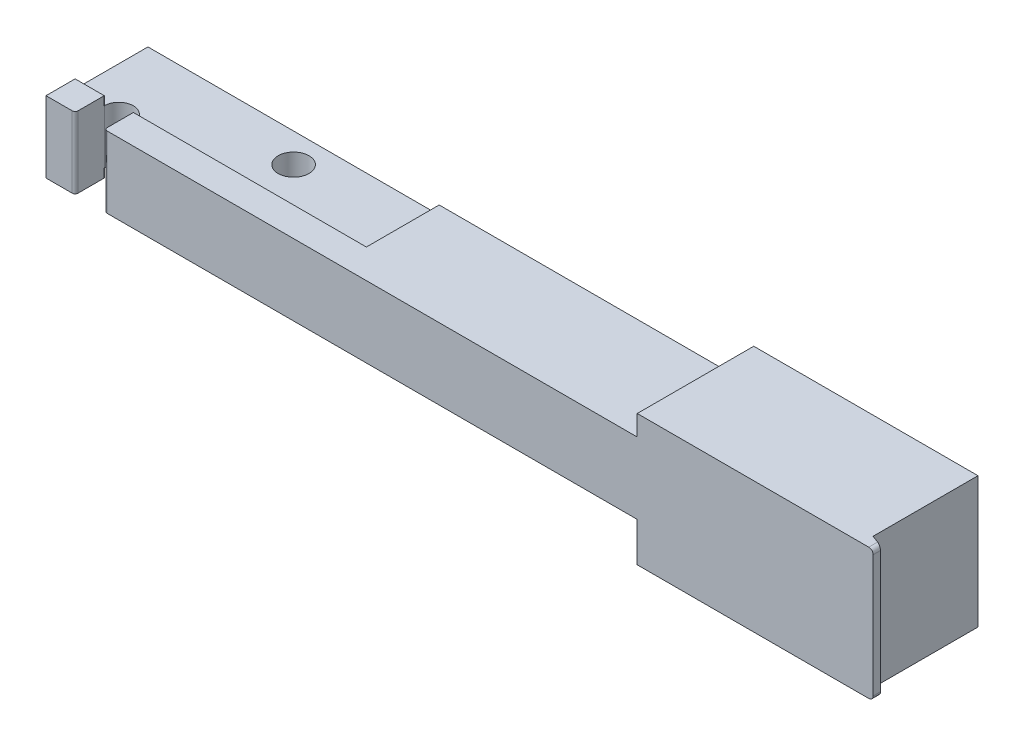
ISO-10303-21;
HEADER;
FILE_DESCRIPTION(('STEP AP214'),'2;1');
FILE_NAME('part.step','',(''),(''),'','','');
FILE_SCHEMA(('AUTOMOTIVE_DESIGN { 1 0 10303 214 1 1 1 1 }'));
ENDSEC;
DATA;
#1=APPLICATION_CONTEXT('core data for automotive mechanical design processes');
#2=APPLICATION_PROTOCOL_DEFINITION('international standard','automotive_design',2000,#1);
#3=PRODUCT_CONTEXT('',#1,'mechanical');
#4=PRODUCT('Part','Part','',(#3));
#5=PRODUCT_RELATED_PRODUCT_CATEGORY('part','',(#4));
#6=PRODUCT_DEFINITION_FORMATION('','',#4);
#7=PRODUCT_DEFINITION_CONTEXT('part definition',#1,'design');
#8=PRODUCT_DEFINITION('design','',#6,#7);
#9=PRODUCT_DEFINITION_SHAPE('','',#8);
#10=(LENGTH_UNIT() NAMED_UNIT(*) SI_UNIT(.MILLI.,.METRE.));
#11=(NAMED_UNIT(*) PLANE_ANGLE_UNIT() SI_UNIT($,.RADIAN.));
#12=(NAMED_UNIT(*) SI_UNIT($,.STERADIAN.) SOLID_ANGLE_UNIT());
#13=UNCERTAINTY_MEASURE_WITH_UNIT(LENGTH_MEASURE(1.E-05),#10,'distance_accuracy_value','');
#14=(GEOMETRIC_REPRESENTATION_CONTEXT(3) GLOBAL_UNCERTAINTY_ASSIGNED_CONTEXT((#13)) GLOBAL_UNIT_ASSIGNED_CONTEXT((#10,
#11,#12)) REPRESENTATION_CONTEXT('',''));
#15=CARTESIAN_POINT('',(0.,0.,0.));
#16=DIRECTION('',(0.,0.,1.));
#17=DIRECTION('',(1.,0.,0.));
#18=AXIS2_PLACEMENT_3D('',#15,#16,#17);
#19=CARTESIAN_POINT('',(7.5,-0.00100000000003569,-5.));
#20=DIRECTION('',(0.,1.,0.));
#21=DIRECTION('',(-1.,0.,0.));
#22=AXIS2_PLACEMENT_3D('',#19,#20,#21);
#23=CYLINDRICAL_SURFACE('',#22,2.5);
#24=CARTESIAN_POINT('',(7.5,8.25,-5.));
#25=DIRECTION('',(0.,1.,0.));
#26=DIRECTION('',(0.,0.,1.));
#27=AXIS2_PLACEMENT_3D('',#24,#25,#26);
#28=CIRCLE('',#27,2.5);
#29=CARTESIAN_POINT('',(5.,8.25,-5.));
#30=VERTEX_POINT('',#29);
#31=CARTESIAN_POINT('',(10.,8.25,-5.));
#32=VERTEX_POINT('',#31);
#33=EDGE_CURVE('E245',#30,#32,#28,.F.);
#34=ORIENTED_EDGE('',*,*,#33,.T.);
#35=DIRECTION('',(0.,1.,0.));
#36=VECTOR('',#35,1.);
#37=CARTESIAN_POINT('',(10.,-0.00100000000003569,-5.));
#38=LINE('',#37,#36);
#39=CARTESIAN_POINT('',(10.,17.5,-5.));
#40=VERTEX_POINT('',#39);
#41=EDGE_CURVE('E238',#32,#40,#38,.T.);
#42=ORIENTED_EDGE('',*,*,#41,.T.);
#43=CARTESIAN_POINT('',(7.5,17.5,-5.));
#44=DIRECTION('',(0.,1.,0.));
#45=DIRECTION('',(0.,0.,1.));
#46=AXIS2_PLACEMENT_3D('',#43,#44,#45);
#47=CIRCLE('',#46,2.5);
#48=CARTESIAN_POINT('',(5.,17.5,-5.));
#49=VERTEX_POINT('',#48);
#50=EDGE_CURVE('E433',#49,#40,#47,.F.);
#51=ORIENTED_EDGE('',*,*,#50,.F.);
#52=DIRECTION('',(0.,1.,0.));
#53=VECTOR('',#52,1.);
#54=CARTESIAN_POINT('',(5.,-0.00100000000003569,-5.));
#55=LINE('',#54,#53);
#56=EDGE_CURVE('E237',#30,#49,#55,.T.);
#57=ORIENTED_EDGE('',*,*,#56,.F.);
#58=EDGE_LOOP('',(#34,#42,#51,#57));
#59=FACE_BOUND('',#58,.T.);
#60=ADVANCED_FACE('F47',(#59),#23,.F.);
#61=CARTESIAN_POINT('',(30.,-0.00100000000003223,-12.5));
#62=DIRECTION('',(0.,1.,0.));
#63=DIRECTION('',(-1.,0.,0.));
#64=AXIS2_PLACEMENT_3D('',#61,#62,#63);
#65=CYLINDRICAL_SURFACE('',#64,2.65);
#66=CARTESIAN_POINT('',(30.,17.5,-12.5));
#67=DIRECTION('',(0.,1.,0.));
#68=DIRECTION('',(0.,0.,1.));
#69=AXIS2_PLACEMENT_3D('',#66,#67,#68);
#70=CIRCLE('',#69,2.65);
#71=CARTESIAN_POINT('',(30.,17.5,-9.85));
#72=VERTEX_POINT('',#71);
#73=EDGE_CURVE('E461',#72,#72,#70,.F.);
#74=ORIENTED_EDGE('',*,*,#73,.F.);
#75=EDGE_LOOP('',(#74));
#76=FACE_BOUND('',#75,.T.);
#77=CARTESIAN_POINT('',(30.,8.25,-12.5));
#78=DIRECTION('',(0.,1.,0.));
#79=DIRECTION('',(0.,0.,1.));
#80=AXIS2_PLACEMENT_3D('',#77,#78,#79);
#81=CIRCLE('',#80,2.65);
#82=CARTESIAN_POINT('',(30.,8.25,-9.85));
#83=VERTEX_POINT('',#82);
#84=EDGE_CURVE('E249',#83,#83,#81,.F.);
#85=ORIENTED_EDGE('',*,*,#84,.T.);
#86=EDGE_LOOP('',(#85));
#87=FACE_BOUND('',#86,.T.);
#88=ADVANCED_FACE('F485',(#76,#87),#65,.F.);
#89=CARTESIAN_POINT('',(0.,0.,-20.));
#90=DIRECTION('',(1.,0.,0.));
#91=DIRECTION('',(0.,0.,-1.));
#92=AXIS2_PLACEMENT_3D('',#89,#90,#91);
#93=PLANE('',#92);
#94=DIRECTION('',(0.,-1.,0.));
#95=VECTOR('',#94,1.);
#96=CARTESIAN_POINT('',(0.,8.25,-5.));
#97=LINE('',#96,#95);
#98=CARTESIAN_POINT('',(0.,8.25,-5.));
#99=VERTEX_POINT('',#98);
#100=CARTESIAN_POINT('',(0.,6.75,-5.));
#101=VERTEX_POINT('',#100);
#102=EDGE_CURVE('E464',#99,#101,#97,.T.);
#103=ORIENTED_EDGE('',*,*,#102,.T.);
#104=DIRECTION('',(0.,0.,1.));
#105=VECTOR('',#104,1.);
#106=CARTESIAN_POINT('',(0.,6.75,-20.));
#107=LINE('',#106,#105);
#108=CARTESIAN_POINT('',(0.,6.75,0.));
#109=VERTEX_POINT('',#108);
#110=EDGE_CURVE('E410',#101,#109,#107,.T.);
#111=ORIENTED_EDGE('',*,*,#110,.T.);
#112=DIRECTION('',(0.,1.,0.));
#113=VECTOR('',#112,1.);
#114=CARTESIAN_POINT('',(0.,0.,0.));
#115=LINE('',#114,#113);
#116=CARTESIAN_POINT('',(0.,19.,0.));
#117=VERTEX_POINT('',#116);
#118=EDGE_CURVE('E291',#109,#117,#115,.T.);
#119=ORIENTED_EDGE('',*,*,#118,.T.);
#120=DIRECTION('',(0.,0.,1.));
#121=VECTOR('',#120,1.);
#122=CARTESIAN_POINT('',(0.,19.,-20.));
#123=LINE('',#122,#121);
#124=CARTESIAN_POINT('',(0.,19.,-5.));
#125=VERTEX_POINT('',#124);
#126=EDGE_CURVE('E413',#125,#117,#123,.T.);
#127=ORIENTED_EDGE('',*,*,#126,.F.);
#128=DIRECTION('',(0.,1.,0.));
#129=VECTOR('',#128,1.);
#130=CARTESIAN_POINT('',(0.,17.5,-5.));
#131=LINE('',#130,#129);
#132=CARTESIAN_POINT('',(0.,17.5,-5.));
#133=VERTEX_POINT('',#132);
#134=EDGE_CURVE('E435',#133,#125,#131,.T.);
#135=ORIENTED_EDGE('',*,*,#134,.F.);
#136=DIRECTION('',(0.,0.,1.));
#137=VECTOR('',#136,1.);
#138=CARTESIAN_POINT('',(0.,17.5,0.));
#139=LINE('',#138,#137);
#140=CARTESIAN_POINT('',(0.,17.5,-17.5));
#141=VERTEX_POINT('',#140);
#142=EDGE_CURVE('E449',#141,#133,#139,.T.);
#143=ORIENTED_EDGE('',*,*,#142,.F.);
#144=DIRECTION('',(0.,1.,0.));
#145=VECTOR('',#144,1.);
#146=CARTESIAN_POINT('',(0.,0.,-17.5));
#147=LINE('',#146,#145);
#148=CARTESIAN_POINT('',(0.,8.25,-17.5));
#149=VERTEX_POINT('',#148);
#150=EDGE_CURVE('E275',#149,#141,#147,.T.);
#151=ORIENTED_EDGE('',*,*,#150,.F.);
#152=DIRECTION('',(0.,0.,1.));
#153=VECTOR('',#152,1.);
#154=CARTESIAN_POINT('',(0.,8.25,0.));
#155=LINE('',#154,#153);
#156=EDGE_CURVE('E479',#149,#99,#155,.T.);
#157=ORIENTED_EDGE('',*,*,#156,.T.);
#158=EDGE_LOOP('',(#103,#111,#119,#127,#135,#143,#151,#157));
#159=FACE_BOUND('',#158,.T.);
#160=ADVANCED_FACE('F503',(#159),#93,.F.);
#161=CARTESIAN_POINT('',(100.,0.,-17.5));
#162=DIRECTION('',(0.,0.,1.));
#163=DIRECTION('',(1.,0.,0.));
#164=AXIS2_PLACEMENT_3D('',#161,#162,#163);
#165=PLANE('',#164);
#166=DIRECTION('',(0.,-1.,0.));
#167=VECTOR('',#166,1.);
#168=CARTESIAN_POINT('',(50.,8.25,-17.5));
#169=LINE('',#168,#167);
#170=CARTESIAN_POINT('',(50.,8.25,-17.5));
#171=VERTEX_POINT('',#170);
#172=CARTESIAN_POINT('',(50.,6.75,-17.5));
#173=VERTEX_POINT('',#172);
#174=EDGE_CURVE('E467',#171,#173,#169,.T.);
#175=ORIENTED_EDGE('',*,*,#174,.F.);
#176=DIRECTION('',(-1.,0.,0.));
#177=VECTOR('',#176,1.);
#178=CARTESIAN_POINT('',(0.,8.25,-17.5));
#179=LINE('',#178,#177);
#180=EDGE_CURVE('E476',#171,#149,#179,.T.);
#181=ORIENTED_EDGE('',*,*,#180,.T.);
#182=ORIENTED_EDGE('',*,*,#150,.T.);
#183=DIRECTION('',(-1.,0.,0.));
#184=VECTOR('',#183,1.);
#185=CARTESIAN_POINT('',(0.,17.5,-17.5));
#186=LINE('',#185,#184);
#187=CARTESIAN_POINT('',(50.,17.5,-17.5));
#188=VERTEX_POINT('',#187);
#189=EDGE_CURVE('E452',#188,#141,#186,.T.);
#190=ORIENTED_EDGE('',*,*,#189,.F.);
#191=DIRECTION('',(0.,1.,0.));
#192=VECTOR('',#191,1.);
#193=CARTESIAN_POINT('',(50.,17.5,-17.5));
#194=LINE('',#193,#192);
#195=CARTESIAN_POINT('',(50.,19.,-17.5));
#196=VERTEX_POINT('',#195);
#197=EDGE_CURVE('E400',#188,#196,#194,.T.);
#198=ORIENTED_EDGE('',*,*,#197,.T.);
#199=DIRECTION('',(1.,0.,0.));
#200=VECTOR('',#199,1.);
#201=CARTESIAN_POINT('',(100.,19.,-17.5));
#202=LINE('',#201,#200);
#203=CARTESIAN_POINT('',(100.,19.,-17.5));
#204=VERTEX_POINT('',#203);
#205=EDGE_CURVE('E377',#196,#204,#202,.T.);
#206=ORIENTED_EDGE('',*,*,#205,.T.);
#207=DIRECTION('',(0.,1.,0.));
#208=VECTOR('',#207,1.);
#209=CARTESIAN_POINT('',(100.,0.,-17.5));
#210=LINE('',#209,#208);
#211=CARTESIAN_POINT('',(100.,6.75,-17.5));
#212=VERTEX_POINT('',#211);
#213=EDGE_CURVE('E274',#212,#204,#210,.T.);
#214=ORIENTED_EDGE('',*,*,#213,.F.);
#215=DIRECTION('',(-1.,0.,0.));
#216=VECTOR('',#215,1.);
#217=CARTESIAN_POINT('',(100.,6.75,-17.5));
#218=LINE('',#217,#216);
#219=EDGE_CURVE('E260',#212,#173,#218,.T.);
#220=ORIENTED_EDGE('',*,*,#219,.T.);
#221=EDGE_LOOP('',(#175,#181,#182,#190,#198,#206,#214,#220));
#222=FACE_BOUND('',#221,.T.);
#223=ADVANCED_FACE('F395',(#222),#165,.F.);
#224=CARTESIAN_POINT('',(0.,6.75,-20.));
#225=DIRECTION('',(0.,1.,0.));
#226=DIRECTION('',(0.,0.,1.));
#227=AXIS2_PLACEMENT_3D('',#224,#225,#226);
#228=PLANE('',#227);
#229=DIRECTION('',(1.,0.,0.));
#230=VECTOR('',#229,1.);
#231=CARTESIAN_POINT('',(0.,6.75,-5.));
#232=LINE('',#231,#230);
#233=CARTESIAN_POINT('',(10.,6.75,-5.));
#234=VERTEX_POINT('',#233);
#235=CARTESIAN_POINT('',(50.,6.75,-5.00000000000001));
#236=VERTEX_POINT('',#235);
#237=EDGE_CURVE('E232',#234,#236,#232,.T.);
#238=ORIENTED_EDGE('',*,*,#237,.T.);
#239=DIRECTION('',(0.,0.,-1.));
#240=VECTOR('',#239,1.);
#241=CARTESIAN_POINT('',(50.,6.75,0.));
#242=LINE('',#241,#240);
#243=EDGE_CURVE('E470',#236,#173,#242,.T.);
#244=ORIENTED_EDGE('',*,*,#243,.T.);
#245=ORIENTED_EDGE('',*,*,#219,.F.);
#246=DIRECTION('',(-0.514495755427527,0.,0.857492925712544));
#247=VECTOR('',#246,1.);
#248=CARTESIAN_POINT('',(100.,6.75,-17.5));
#249=LINE('',#248,#247);
#250=CARTESIAN_POINT('',(101.5,6.75,-20.));
#251=VERTEX_POINT('',#250);
#252=EDGE_CURVE('E262',#251,#212,#249,.T.);
#253=ORIENTED_EDGE('',*,*,#252,.F.);
#254=DIRECTION('',(0.,0.,1.));
#255=VECTOR('',#254,1.);
#256=CARTESIAN_POINT('',(101.5,6.75,-20.));
#257=LINE('',#256,#255);
#258=CARTESIAN_POINT('',(101.5,6.75,0.));
#259=VERTEX_POINT('',#258);
#260=EDGE_CURVE('E424',#251,#259,#257,.T.);
#261=ORIENTED_EDGE('',*,*,#260,.T.);
#262=DIRECTION('',(-1.,0.,0.));
#263=VECTOR('',#262,1.);
#264=CARTESIAN_POINT('',(0.,6.75,0.));
#265=LINE('',#264,#263);
#266=CARTESIAN_POINT('',(10.5,6.75,0.));
#267=VERTEX_POINT('',#266);
#268=EDGE_CURVE('E375',#259,#267,#265,.T.);
#269=ORIENTED_EDGE('',*,*,#268,.T.);
#270=CARTESIAN_POINT('',(10.5,6.75,-0.5));
#271=DIRECTION('',(0.,1.,0.));
#272=DIRECTION('',(0.,0.,1.));
#273=AXIS2_PLACEMENT_3D('',#270,#271,#272);
#274=CIRCLE('',#273,0.5);
#275=CARTESIAN_POINT('',(10.,6.75,-0.5));
#276=VERTEX_POINT('',#275);
#277=EDGE_CURVE('E11',#267,#276,#274,.F.);
#278=ORIENTED_EDGE('',*,*,#277,.T.);
#279=DIRECTION('',(0.,0.,1.));
#280=VECTOR('',#279,1.);
#281=CARTESIAN_POINT('',(10.,6.75,0.));
#282=LINE('',#281,#280);
#283=EDGE_CURVE('E374',#234,#276,#282,.T.);
#284=ORIENTED_EDGE('',*,*,#283,.F.);
#285=EDGE_LOOP('',(#238,#244,#245,#253,#261,#269,#278,#284));
#286=FACE_BOUND('',#285,.T.);
#287=ADVANCED_FACE('F373',(#286),#228,.F.);
#288=CARTESIAN_POINT('',(5.,6.75,-5.));
#289=VERTEX_POINT('',#288);
#290=EDGE_CURVE('E473',#101,#289,#232,.T.);
#291=ORIENTED_EDGE('',*,*,#290,.T.);
#292=DIRECTION('',(0.,0.,1.));
#293=VECTOR('',#292,1.);
#294=CARTESIAN_POINT('',(5.,6.75,0.));
#295=LINE('',#294,#293);
#296=CARTESIAN_POINT('',(5.,6.75,-0.5));
#297=VERTEX_POINT('',#296);
#298=EDGE_CURVE('E376',#289,#297,#295,.T.);
#299=ORIENTED_EDGE('',*,*,#298,.T.);
#300=CARTESIAN_POINT('',(4.5,6.75,-0.5));
#301=DIRECTION('',(0.,1.,0.));
#302=DIRECTION('',(0.,0.,1.));
#303=AXIS2_PLACEMENT_3D('',#300,#301,#302);
#304=CIRCLE('',#303,0.5);
#305=CARTESIAN_POINT('',(4.5,6.75,0.));
#306=VERTEX_POINT('',#305);
#307=EDGE_CURVE('E379',#297,#306,#304,.F.);
#308=ORIENTED_EDGE('',*,*,#307,.T.);
#309=EDGE_CURVE('E428',#306,#109,#265,.T.);
#310=ORIENTED_EDGE('',*,*,#309,.T.);
#311=ORIENTED_EDGE('',*,*,#110,.F.);
#312=EDGE_LOOP('',(#291,#299,#308,#310,#311));
#313=FACE_BOUND('',#312,.T.);
#314=ADVANCED_FACE('F603',(#313),#228,.F.);
#315=CARTESIAN_POINT('',(0.,19.,-20.));
#316=DIRECTION('',(0.,-1.,0.));
#317=DIRECTION('',(0.,0.,-1.));
#318=AXIS2_PLACEMENT_3D('',#315,#316,#317);
#319=PLANE('',#318);
#320=DIRECTION('',(0.,0.,-1.));
#321=VECTOR('',#320,1.);
#322=CARTESIAN_POINT('',(5.,19.,0.));
#323=LINE('',#322,#321);
#324=CARTESIAN_POINT('',(5.,19.,-0.5));
#325=VERTEX_POINT('',#324);
#326=CARTESIAN_POINT('',(5.,19.,-5.));
#327=VERTEX_POINT('',#326);
#328=EDGE_CURVE('E404',#325,#327,#323,.T.);
#329=ORIENTED_EDGE('',*,*,#328,.T.);
#330=DIRECTION('',(1.,0.,0.));
#331=VECTOR('',#330,1.);
#332=CARTESIAN_POINT('',(0.,19.,-5.));
#333=LINE('',#332,#331);
#334=EDGE_CURVE('E443',#125,#327,#333,.T.);
#335=ORIENTED_EDGE('',*,*,#334,.F.);
#336=ORIENTED_EDGE('',*,*,#126,.T.);
#337=DIRECTION('',(1.,0.,0.));
#338=VECTOR('',#337,1.);
#339=CARTESIAN_POINT('',(0.,19.,0.));
#340=LINE('',#339,#338);
#341=CARTESIAN_POINT('',(4.5,19.,0.));
#342=VERTEX_POINT('',#341);
#343=EDGE_CURVE('E369',#117,#342,#340,.T.);
#344=ORIENTED_EDGE('',*,*,#343,.T.);
#345=CARTESIAN_POINT('',(4.5,19.,-0.5));
#346=DIRECTION('',(0.,-1.,0.));
#347=DIRECTION('',(0.,0.,-1.));
#348=AXIS2_PLACEMENT_3D('',#345,#346,#347);
#349=CIRCLE('',#348,0.5);
#350=EDGE_CURVE('E403',#342,#325,#349,.F.);
#351=ORIENTED_EDGE('',*,*,#350,.T.);
#352=EDGE_LOOP('',(#329,#335,#336,#344,#351));
#353=FACE_BOUND('',#352,.T.);
#354=ADVANCED_FACE('F558',(#353),#319,.F.);
#355=CARTESIAN_POINT('',(0.,22.5,-20.));
#356=DIRECTION('',(0.,-1.,0.));
#357=DIRECTION('',(1.,0.,0.));
#358=AXIS2_PLACEMENT_3D('',#355,#356,#357);
#359=PLANE('',#358);
#360=DIRECTION('',(1.,0.,0.));
#361=VECTOR('',#360,1.);
#362=CARTESIAN_POINT('',(0.,22.5,-20.));
#363=LINE('',#362,#361);
#364=CARTESIAN_POINT('',(101.5,22.5,-20.));
#365=VERTEX_POINT('',#364);
#366=CARTESIAN_POINT('',(140.,22.5,-20.));
#367=VERTEX_POINT('',#366);
#368=EDGE_CURVE('E292',#365,#367,#363,.T.);
#369=ORIENTED_EDGE('',*,*,#368,.F.);
#370=DIRECTION('',(0.,0.,1.));
#371=VECTOR('',#370,1.);
#372=CARTESIAN_POINT('',(101.5,22.5,-20.));
#373=LINE('',#372,#371);
#374=CARTESIAN_POINT('',(101.5,22.5,0.));
#375=VERTEX_POINT('',#374);
#376=EDGE_CURVE('E417',#365,#375,#373,.T.);
#377=ORIENTED_EDGE('',*,*,#376,.T.);
#378=DIRECTION('',(1.,0.,0.));
#379=VECTOR('',#378,1.);
#380=CARTESIAN_POINT('',(0.,22.5,0.));
#381=LINE('',#380,#379);
#382=CARTESIAN_POINT('',(141.25,22.5,0.));
#383=VERTEX_POINT('',#382);
#384=EDGE_CURVE('E300',#375,#383,#381,.T.);
#385=ORIENTED_EDGE('',*,*,#384,.T.);
#386=DIRECTION('',(0.,0.,1.));
#387=VECTOR('',#386,1.);
#388=CARTESIAN_POINT('',(141.25,22.5,-1.24999999999999));
#389=LINE('',#388,#387);
#390=CARTESIAN_POINT('',(141.25,22.5,-1.52297767569964));
#391=VERTEX_POINT('',#390);
#392=EDGE_CURVE('E333',#383,#391,#389,.F.);
#393=ORIENTED_EDGE('',*,*,#392,.T.);
#394=DIRECTION('',(0.939692620785909,0.,0.342020143325667));
#395=VECTOR('',#394,1.);
#396=CARTESIAN_POINT('',(142.,22.5,-1.24999999999999));
#397=LINE('',#396,#395);
#398=CARTESIAN_POINT('',(140.,22.5,-1.97794046853239));
#399=VERTEX_POINT('',#398);
#400=EDGE_CURVE('E308',#391,#399,#397,.F.);
#401=ORIENTED_EDGE('',*,*,#400,.T.);
#402=DIRECTION('',(0.,0.,1.));
#403=VECTOR('',#402,1.);
#404=CARTESIAN_POINT('',(140.,22.5,-20.));
#405=LINE('',#404,#403);
#406=EDGE_CURVE('E285',#367,#399,#405,.T.);
#407=ORIENTED_EDGE('',*,*,#406,.F.);
#408=EDGE_LOOP('',(#369,#377,#385,#393,#401,#407));
#409=FACE_BOUND('',#408,.T.);
#410=ADVANCED_FACE('F551',(#409),#359,.F.);
#411=CARTESIAN_POINT('',(0.,0.,-20.));
#412=DIRECTION('',(0.,-1.,0.));
#413=DIRECTION('',(1.,0.,0.));
#414=AXIS2_PLACEMENT_3D('',#411,#412,#413);
#415=PLANE('',#414);
#416=DIRECTION('',(0.,0.,1.));
#417=VECTOR('',#416,1.);
#418=CARTESIAN_POINT('',(101.5,0.,-20.));
#419=LINE('',#418,#417);
#420=CARTESIAN_POINT('',(101.5,0.,-20.));
#421=VERTEX_POINT('',#420);
#422=CARTESIAN_POINT('',(101.5,0.,0.));
#423=VERTEX_POINT('',#422);
#424=EDGE_CURVE('E422',#421,#423,#419,.T.);
#425=ORIENTED_EDGE('',*,*,#424,.F.);
#426=DIRECTION('',(1.,0.,0.));
#427=VECTOR('',#426,1.);
#428=CARTESIAN_POINT('',(0.,0.,-20.));
#429=LINE('',#428,#427);
#430=CARTESIAN_POINT('',(140.,0.,-20.));
#431=VERTEX_POINT('',#430);
#432=EDGE_CURVE('E294',#421,#431,#429,.T.);
#433=ORIENTED_EDGE('',*,*,#432,.T.);
#434=DIRECTION('',(0.,0.,1.));
#435=VECTOR('',#434,1.);
#436=CARTESIAN_POINT('',(140.,0.,-20.));
#437=LINE('',#436,#435);
#438=CARTESIAN_POINT('',(140.,0.,-1.97794046853239));
#439=VERTEX_POINT('',#438);
#440=EDGE_CURVE('E277',#431,#439,#437,.T.);
#441=ORIENTED_EDGE('',*,*,#440,.T.);
#442=DIRECTION('',(-0.939692620785909,0.,-0.342020143325667));
#443=VECTOR('',#442,1.);
#444=CARTESIAN_POINT('',(10.5847106977411,0.,-49.0812536335036));
#445=LINE('',#444,#443);
#446=CARTESIAN_POINT('',(141.25,0.,-1.52297767569964));
#447=VERTEX_POINT('',#446);
#448=EDGE_CURVE('E310',#439,#447,#445,.F.);
#449=ORIENTED_EDGE('',*,*,#448,.T.);
#450=DIRECTION('',(0.,0.,1.));
#451=VECTOR('',#450,1.);
#452=CARTESIAN_POINT('',(141.25,0.,-20.));
#453=LINE('',#452,#451);
#454=CARTESIAN_POINT('',(141.25,0.,0.));
#455=VERTEX_POINT('',#454);
#456=EDGE_CURVE('E316',#447,#455,#453,.T.);
#457=ORIENTED_EDGE('',*,*,#456,.T.);
#458=DIRECTION('',(1.,0.,0.));
#459=VECTOR('',#458,1.);
#460=CARTESIAN_POINT('',(0.,0.,0.));
#461=LINE('',#460,#459);
#462=EDGE_CURVE('E295',#423,#455,#461,.T.);
#463=ORIENTED_EDGE('',*,*,#462,.F.);
#464=EDGE_LOOP('',(#425,#433,#441,#449,#457,#463));
#465=FACE_BOUND('',#464,.T.);
#466=ADVANCED_FACE('F548',(#465),#415,.T.);
#467=CARTESIAN_POINT('',(0.,0.,0.));
#468=DIRECTION('',(0.,0.,-1.));
#469=DIRECTION('',(-1.,0.,0.));
#470=AXIS2_PLACEMENT_3D('',#467,#468,#469);
#471=PLANE('',#470);
#472=ORIENTED_EDGE('',*,*,#118,.F.);
#473=ORIENTED_EDGE('',*,*,#309,.F.);
#474=DIRECTION('',(0.,-1.,0.));
#475=VECTOR('',#474,1.);
#476=CARTESIAN_POINT('',(4.5,22.5,0.));
#477=LINE('',#476,#475);
#478=EDGE_CURVE('E347',#306,#342,#477,.F.);
#479=ORIENTED_EDGE('',*,*,#478,.T.);
#480=ORIENTED_EDGE('',*,*,#343,.F.);
#481=EDGE_LOOP('',(#472,#473,#479,#480));
#482=FACE_BOUND('',#481,.T.);
#483=ADVANCED_FACE('F529',(#482),#471,.F.);
#484=CARTESIAN_POINT('',(126.5,11.25,-15.));
#485=DIRECTION('',(0.,0.,-1.));
#486=DIRECTION('',(-1.,0.,0.));
#487=AXIS2_PLACEMENT_3D('',#484,#485,#486);
#488=CYLINDRICAL_SURFACE('',#487,2.99999999999999);
#489=CARTESIAN_POINT('',(126.5,11.25,-20.));
#490=DIRECTION('',(0.,0.,-1.));
#491=DIRECTION('',(-1.,0.,0.));
#492=AXIS2_PLACEMENT_3D('',#489,#490,#491);
#493=CIRCLE('',#492,2.99999999999999);
#494=CARTESIAN_POINT('',(123.5,11.25,-20.));
#495=VERTEX_POINT('',#494);
#496=EDGE_CURVE('E271',#495,#495,#493,.T.);
#497=ORIENTED_EDGE('',*,*,#496,.T.);
#498=EDGE_LOOP('',(#497));
#499=FACE_BOUND('',#498,.T.);
#500=CARTESIAN_POINT('',(126.5,11.25,-16.));
#501=DIRECTION('',(0.,0.,-1.));
#502=DIRECTION('',(-1.,0.,0.));
#503=AXIS2_PLACEMENT_3D('',#500,#501,#502);
#504=CIRCLE('',#503,2.99999999999999);
#505=CARTESIAN_POINT('',(123.5,11.25,-16.));
#506=VERTEX_POINT('',#505);
#507=EDGE_CURVE('E335',#506,#506,#504,.T.);
#508=ORIENTED_EDGE('',*,*,#507,.F.);
#509=EDGE_LOOP('',(#508));
#510=FACE_BOUND('',#509,.T.);
#511=ADVANCED_FACE('F526',(#499,#510),#488,.F.);
#512=CARTESIAN_POINT('',(142.,0.,-20.));
#513=DIRECTION('',(1.,0.,0.));
#514=DIRECTION('',(0.,0.,-1.));
#515=AXIS2_PLACEMENT_3D('',#512,#513,#514);
#516=PLANE('',#515);
#517=DIRECTION('',(0.,1.,0.));
#518=VECTOR('',#517,1.);
#519=CARTESIAN_POINT('',(142.,0.,0.));
#520=LINE('',#519,#518);
#521=CARTESIAN_POINT('',(142.,0.750000000000017,0.));
#522=VERTEX_POINT('',#521);
#523=CARTESIAN_POINT('',(142.,21.75,0.));
#524=VERTEX_POINT('',#523);
#525=EDGE_CURVE('E302',#522,#524,#520,.T.);
#526=ORIENTED_EDGE('',*,*,#525,.F.);
#527=DIRECTION('',(0.,0.,1.));
#528=VECTOR('',#527,1.);
#529=CARTESIAN_POINT('',(142.,0.750000000000017,-20.));
#530=LINE('',#529,#528);
#531=CARTESIAN_POINT('',(142.,0.750000000000017,-1.24999999999999));
#532=VERTEX_POINT('',#531);
#533=EDGE_CURVE('E327',#522,#532,#530,.F.);
#534=ORIENTED_EDGE('',*,*,#533,.T.);
#535=DIRECTION('',(0.,1.,0.));
#536=VECTOR('',#535,1.);
#537=CARTESIAN_POINT('',(142.,0.,-1.24999999999999));
#538=LINE('',#537,#536);
#539=CARTESIAN_POINT('',(142.,21.75,-1.24999999999999));
#540=VERTEX_POINT('',#539);
#541=EDGE_CURVE('E297',#532,#540,#538,.T.);
#542=ORIENTED_EDGE('',*,*,#541,.T.);
#543=DIRECTION('',(0.,0.,1.));
#544=VECTOR('',#543,1.);
#545=CARTESIAN_POINT('',(142.,21.75,0.));
#546=LINE('',#545,#544);
#547=EDGE_CURVE('E324',#540,#524,#546,.T.);
#548=ORIENTED_EDGE('',*,*,#547,.T.);
#549=EDGE_LOOP('',(#526,#534,#542,#548));
#550=FACE_BOUND('',#549,.T.);
#551=ADVANCED_FACE('F528',(#550),#516,.T.);
#552=CARTESIAN_POINT('',(0.,0.,-20.));
#553=DIRECTION('',(0.,0.,-1.));
#554=DIRECTION('',(-1.,0.,0.));
#555=AXIS2_PLACEMENT_3D('',#552,#553,#554);
#556=PLANE('',#555);
#557=ORIENTED_EDGE('',*,*,#496,.F.);
#558=EDGE_LOOP('',(#557));
#559=FACE_BOUND('',#558,.T.);
#560=DIRECTION('',(0.,1.,0.));
#561=VECTOR('',#560,1.);
#562=CARTESIAN_POINT('',(101.5,0.,-20.));
#563=LINE('',#562,#561);
#564=EDGE_CURVE('E278',#421,#251,#563,.T.);
#565=ORIENTED_EDGE('',*,*,#564,.T.);
#566=CARTESIAN_POINT('',(101.5,19.,-20.));
#567=VERTEX_POINT('',#566);
#568=EDGE_CURVE('E281',#251,#567,#563,.T.);
#569=ORIENTED_EDGE('',*,*,#568,.T.);
#570=DIRECTION('',(0.,1.,0.));
#571=VECTOR('',#570,1.);
#572=CARTESIAN_POINT('',(101.5,22.5,-20.));
#573=LINE('',#572,#571);
#574=EDGE_CURVE('E411',#567,#365,#573,.T.);
#575=ORIENTED_EDGE('',*,*,#574,.T.);
#576=ORIENTED_EDGE('',*,*,#368,.T.);
#577=DIRECTION('',(0.,1.,0.));
#578=VECTOR('',#577,1.);
#579=CARTESIAN_POINT('',(140.,0.,-20.));
#580=LINE('',#579,#578);
#581=EDGE_CURVE('E288',#431,#367,#580,.T.);
#582=ORIENTED_EDGE('',*,*,#581,.F.);
#583=ORIENTED_EDGE('',*,*,#432,.F.);
#584=EDGE_LOOP('',(#565,#569,#575,#576,#582,#583));
#585=FACE_BOUND('',#584,.T.);
#586=ADVANCED_FACE('F542',(#559,#585),#556,.T.);
#587=DIRECTION('',(0.,1.,0.));
#588=VECTOR('',#587,1.);
#589=CARTESIAN_POINT('',(10.5,0.,0.));
#590=LINE('',#589,#588);
#591=CARTESIAN_POINT('',(10.5,19.,0.));
#592=VERTEX_POINT('',#591);
#593=EDGE_CURVE('E353',#592,#267,#590,.F.);
#594=ORIENTED_EDGE('',*,*,#593,.T.);
#595=ORIENTED_EDGE('',*,*,#268,.F.);
#596=DIRECTION('',(0.,1.,0.));
#597=VECTOR('',#596,1.);
#598=CARTESIAN_POINT('',(101.5,0.,0.));
#599=LINE('',#598,#597);
#600=EDGE_CURVE('E415',#423,#259,#599,.T.);
#601=ORIENTED_EDGE('',*,*,#600,.F.);
#602=ORIENTED_EDGE('',*,*,#462,.T.);
#603=CARTESIAN_POINT('',(141.25,0.750000000000017,0.));
#604=DIRECTION('',(0.,0.,-1.));
#605=DIRECTION('',(-1.,0.,0.));
#606=AXIS2_PLACEMENT_3D('',#603,#604,#605);
#607=CIRCLE('',#606,0.75);
#608=EDGE_CURVE('E322',#455,#522,#607,.F.);
#609=ORIENTED_EDGE('',*,*,#608,.T.);
#610=ORIENTED_EDGE('',*,*,#525,.T.);
#611=CARTESIAN_POINT('',(141.25,21.75,0.));
#612=DIRECTION('',(0.,0.,-1.));
#613=DIRECTION('',(-1.,0.,0.));
#614=AXIS2_PLACEMENT_3D('',#611,#612,#613);
#615=CIRCLE('',#614,0.75);
#616=EDGE_CURVE('E319',#524,#383,#615,.F.);
#617=ORIENTED_EDGE('',*,*,#616,.T.);
#618=ORIENTED_EDGE('',*,*,#384,.F.);
#619=DIRECTION('',(0.,1.,0.));
#620=VECTOR('',#619,1.);
#621=CARTESIAN_POINT('',(101.5,22.5,0.));
#622=LINE('',#621,#620);
#623=CARTESIAN_POINT('',(101.5,19.,0.));
#624=VERTEX_POINT('',#623);
#625=EDGE_CURVE('E368',#624,#375,#622,.T.);
#626=ORIENTED_EDGE('',*,*,#625,.F.);
#627=EDGE_CURVE('E358',#592,#624,#340,.T.);
#628=ORIENTED_EDGE('',*,*,#627,.F.);
#629=EDGE_LOOP('',(#594,#595,#601,#602,#609,#610,#617,#618,#626,#628));
#630=FACE_BOUND('',#629,.T.);
#631=ADVANCED_FACE('F365',(#630),#471,.F.);
#632=CARTESIAN_POINT('',(140.,0.,0.));
#633=DIRECTION('',(-1.,0.,0.));
#634=DIRECTION('',(0.,0.,1.));
#635=AXIS2_PLACEMENT_3D('',#632,#633,#634);
#636=PLANE('',#635);
#637=ORIENTED_EDGE('',*,*,#440,.F.);
#638=ORIENTED_EDGE('',*,*,#581,.T.);
#639=ORIENTED_EDGE('',*,*,#406,.T.);
#640=DIRECTION('',(0.,1.,0.));
#641=VECTOR('',#640,1.);
#642=CARTESIAN_POINT('',(140.,0.,-1.97794046853239));
#643=LINE('',#642,#641);
#644=EDGE_CURVE('E313',#399,#439,#643,.F.);
#645=ORIENTED_EDGE('',*,*,#644,.T.);
#646=EDGE_LOOP('',(#637,#638,#639,#645));
#647=FACE_BOUND('',#646,.T.);
#648=ADVANCED_FACE('F537',(#647),#636,.F.);
#649=CARTESIAN_POINT('',(142.,0.,-1.24999999999999));
#650=DIRECTION('',(-0.342020143325667,0.,0.939692620785909));
#651=DIRECTION('',(0.,1.,0.));
#652=AXIS2_PLACEMENT_3D('',#649,#650,#651);
#653=PLANE('',#652);
#654=ORIENTED_EDGE('',*,*,#541,.F.);
#655=CARTESIAN_POINT('',(141.25,0.750000000000017,-1.52297767569964));
#656=DIRECTION('',(-0.342020143325667,0.,0.939692620785909));
#657=DIRECTION('',(0.939692620785909,0.,0.342020143325667));
#658=AXIS2_PLACEMENT_3D('',#655,#656,#657);
#659=ELLIPSE('',#658,0.798133329356934,0.75);
#660=EDGE_CURVE('E331',#532,#447,#659,.F.);
#661=ORIENTED_EDGE('',*,*,#660,.T.);
#662=ORIENTED_EDGE('',*,*,#448,.F.);
#663=ORIENTED_EDGE('',*,*,#644,.F.);
#664=ORIENTED_EDGE('',*,*,#400,.F.);
#665=CARTESIAN_POINT('',(141.25,21.75,-1.52297767569964));
#666=DIRECTION('',(-0.342020143325667,0.,0.939692620785909));
#667=DIRECTION('',(-0.939692620785909,0.,-0.342020143325667));
#668=AXIS2_PLACEMENT_3D('',#665,#666,#667);
#669=ELLIPSE('',#668,0.798133329356934,0.75);
#670=EDGE_CURVE('E329',#391,#540,#669,.F.);
#671=ORIENTED_EDGE('',*,*,#670,.T.);
#672=EDGE_LOOP('',(#654,#661,#662,#663,#664,#671));
#673=FACE_BOUND('',#672,.T.);
#674=ADVANCED_FACE('F540',(#673),#653,.F.);
#675=CARTESIAN_POINT('',(141.25,0.750000000000017,-20.));
#676=DIRECTION('',(0.,0.,1.));
#677=DIRECTION('',(1.,0.,0.));
#678=AXIS2_PLACEMENT_3D('',#675,#676,#677);
#679=CYLINDRICAL_SURFACE('',#678,0.75);
#680=ORIENTED_EDGE('',*,*,#660,.F.);
#681=ORIENTED_EDGE('',*,*,#533,.F.);
#682=ORIENTED_EDGE('',*,*,#608,.F.);
#683=ORIENTED_EDGE('',*,*,#456,.F.);
#684=EDGE_LOOP('',(#680,#681,#682,#683));
#685=FACE_BOUND('',#684,.T.);
#686=ADVANCED_FACE('F568',(#685),#679,.T.);
#687=CARTESIAN_POINT('',(141.25,21.75,-20.));
#688=DIRECTION('',(0.,0.,-1.));
#689=DIRECTION('',(-1.,0.,0.));
#690=AXIS2_PLACEMENT_3D('',#687,#688,#689);
#691=CYLINDRICAL_SURFACE('',#690,0.75);
#692=ORIENTED_EDGE('',*,*,#670,.F.);
#693=ORIENTED_EDGE('',*,*,#392,.F.);
#694=ORIENTED_EDGE('',*,*,#616,.F.);
#695=ORIENTED_EDGE('',*,*,#547,.F.);
#696=EDGE_LOOP('',(#692,#693,#694,#695));
#697=FACE_BOUND('',#696,.T.);
#698=ADVANCED_FACE('F534',(#697),#691,.T.);
#699=CARTESIAN_POINT('',(100.,0.,-17.5));
#700=DIRECTION('',(0.857492925712544,0.,0.514495755427527));
#701=DIRECTION('',(0.514495755427527,0.,-0.857492925712544));
#702=AXIS2_PLACEMENT_3D('',#699,#700,#701);
#703=PLANE('',#702);
#704=ORIENTED_EDGE('',*,*,#568,.F.);
#705=ORIENTED_EDGE('',*,*,#252,.T.);
#706=ORIENTED_EDGE('',*,*,#213,.T.);
#707=DIRECTION('',(0.514495755427527,0.,-0.857492925712544));
#708=VECTOR('',#707,1.);
#709=CARTESIAN_POINT('',(100.,19.,-17.5));
#710=LINE('',#709,#708);
#711=EDGE_CURVE('E381',#204,#567,#710,.T.);
#712=ORIENTED_EDGE('',*,*,#711,.T.);
#713=EDGE_LOOP('',(#704,#705,#706,#712));
#714=FACE_BOUND('',#713,.T.);
#715=ADVANCED_FACE('F389',(#714),#703,.F.);
#716=CARTESIAN_POINT('',(126.5,11.25,-15.));
#717=DIRECTION('',(0.,0.,1.));
#718=DIRECTION('',(1.,0.,0.));
#719=AXIS2_PLACEMENT_3D('',#716,#717,#718);
#720=CONICAL_SURFACE('',#719,3.,0.785398163397428);
#721=CARTESIAN_POINT('',(126.5,11.25,-15.2171572875254));
#722=DIRECTION('',(0.,0.,-1.));
#723=DIRECTION('',(-1.,0.,0.));
#724=AXIS2_PLACEMENT_3D('',#721,#722,#723);
#725=CIRCLE('',#724,2.78284271247463);
#726=CARTESIAN_POINT('',(123.717157287525,11.25,-15.2171572875254));
#727=VERTEX_POINT('',#726);
#728=EDGE_CURVE('E341',#727,#727,#725,.T.);
#729=ORIENTED_EDGE('',*,*,#728,.T.);
#730=EDGE_LOOP('',(#729));
#731=FACE_BOUND('',#730,.T.);
#732=CARTESIAN_POINT('',(126.5,11.25,-15.));
#733=DIRECTION('',(0.,0.,1.));
#734=DIRECTION('',(1.,0.,0.));
#735=AXIS2_PLACEMENT_3D('',#732,#733,#734);
#736=CIRCLE('',#735,3.);
#737=CARTESIAN_POINT('',(129.5,11.25,-15.));
#738=VERTEX_POINT('',#737);
#739=EDGE_CURVE('E268',#738,#738,#736,.T.);
#740=ORIENTED_EDGE('',*,*,#739,.T.);
#741=EDGE_LOOP('',(#740));
#742=FACE_BOUND('',#741,.T.);
#743=ADVANCED_FACE('F518',(#731,#742),#720,.F.);
#744=CARTESIAN_POINT('',(126.5,11.25,-15.5));
#745=DIRECTION('',(0.,0.,-1.));
#746=DIRECTION('',(-1.,0.,0.));
#747=AXIS2_PLACEMENT_3D('',#744,#745,#746);
#748=CONICAL_SURFACE('',#747,2.50000000000002,0.785398163397436);
#749=CARTESIAN_POINT('',(126.5,11.25,-15.7828427124746));
#750=DIRECTION('',(0.,0.,1.));
#751=DIRECTION('',(1.,0.,0.));
#752=AXIS2_PLACEMENT_3D('',#749,#750,#751);
#753=CIRCLE('',#752,2.78284271247463);
#754=CARTESIAN_POINT('',(129.282842712475,11.25,-15.7828427124746));
#755=VERTEX_POINT('',#754);
#756=EDGE_CURVE('E338',#755,#755,#753,.T.);
#757=ORIENTED_EDGE('',*,*,#756,.T.);
#758=EDGE_LOOP('',(#757));
#759=FACE_BOUND('',#758,.T.);
#760=ORIENTED_EDGE('',*,*,#507,.T.);
#761=EDGE_LOOP('',(#760));
#762=FACE_BOUND('',#761,.T.);
#763=ADVANCED_FACE('F514',(#759,#762),#748,.F.);
#764=CARTESIAN_POINT('',(126.5,11.25,-15.));
#765=DIRECTION('',(0.,0.,-1.));
#766=DIRECTION('',(-1.,0.,0.));
#767=AXIS2_PLACEMENT_3D('',#764,#765,#766);
#768=PLANE('',#767);
#769=ORIENTED_EDGE('',*,*,#739,.F.);
#770=EDGE_LOOP('',(#769));
#771=FACE_BOUND('',#770,.T.);
#772=ADVANCED_FACE('F517',(#771),#768,.T.);
#773=CARTESIAN_POINT('',(126.5,11.25,-15.5));
#774=DIRECTION('',(0.,0.,-1.));
#775=DIRECTION('',(-1.,0.,0.));
#776=AXIS2_PLACEMENT_3D('',#773,#774,#775);
#777=TOROIDAL_SURFACE('',#776,3.06568542494925,0.4);
#778=ORIENTED_EDGE('',*,*,#728,.F.);
#779=EDGE_LOOP('',(#778));
#780=FACE_BOUND('',#779,.T.);
#781=ORIENTED_EDGE('',*,*,#756,.F.);
#782=EDGE_LOOP('',(#781));
#783=FACE_BOUND('',#782,.T.);
#784=ADVANCED_FACE('F512',(#780,#783),#777,.T.);
#785=CARTESIAN_POINT('',(5.,-0.00100000000003569,0.));
#786=DIRECTION('',(1.,0.,0.));
#787=DIRECTION('',(0.,1.,0.));
#788=AXIS2_PLACEMENT_3D('',#785,#786,#787);
#789=PLANE('',#788);
#790=ORIENTED_EDGE('',*,*,#298,.F.);
#791=EDGE_CURVE('E266',#289,#30,#55,.T.);
#792=ORIENTED_EDGE('',*,*,#791,.T.);
#793=ORIENTED_EDGE('',*,*,#56,.T.);
#794=DIRECTION('',(0.,1.,0.));
#795=VECTOR('',#794,1.);
#796=CARTESIAN_POINT('',(5.,17.5,-5.));
#797=LINE('',#796,#795);
#798=EDGE_CURVE('E437',#49,#327,#797,.T.);
#799=ORIENTED_EDGE('',*,*,#798,.T.);
#800=ORIENTED_EDGE('',*,*,#328,.F.);
#801=DIRECTION('',(0.,-1.,0.));
#802=VECTOR('',#801,1.);
#803=CARTESIAN_POINT('',(5.,0.,-0.5));
#804=LINE('',#803,#802);
#805=EDGE_CURVE('E344',#325,#297,#804,.T.);
#806=ORIENTED_EDGE('',*,*,#805,.T.);
#807=EDGE_LOOP('',(#790,#792,#793,#799,#800,#806));
#808=FACE_BOUND('',#807,.T.);
#809=ADVANCED_FACE('F509',(#808),#789,.T.);
#810=CARTESIAN_POINT('',(10.,-0.00100000000003569,0.));
#811=DIRECTION('',(1.,0.,0.));
#812=DIRECTION('',(0.,0.,-1.));
#813=AXIS2_PLACEMENT_3D('',#810,#811,#812);
#814=PLANE('',#813);
#815=EDGE_CURVE('E225',#234,#32,#38,.T.);
#816=ORIENTED_EDGE('',*,*,#815,.F.);
#817=ORIENTED_EDGE('',*,*,#283,.T.);
#818=DIRECTION('',(0.,1.,0.));
#819=VECTOR('',#818,1.);
#820=CARTESIAN_POINT('',(10.,-0.00100000000003569,-0.5));
#821=LINE('',#820,#819);
#822=CARTESIAN_POINT('',(10.,19.,-0.5));
#823=VERTEX_POINT('',#822);
#824=EDGE_CURVE('E350',#276,#823,#821,.T.);
#825=ORIENTED_EDGE('',*,*,#824,.T.);
#826=DIRECTION('',(0.,0.,-1.));
#827=VECTOR('',#826,1.);
#828=CARTESIAN_POINT('',(10.,19.,0.));
#829=LINE('',#828,#827);
#830=CARTESIAN_POINT('',(10.,19.,-5.));
#831=VERTEX_POINT('',#830);
#832=EDGE_CURVE('E69',#823,#831,#829,.T.);
#833=ORIENTED_EDGE('',*,*,#832,.T.);
#834=DIRECTION('',(0.,1.,0.));
#835=VECTOR('',#834,1.);
#836=CARTESIAN_POINT('',(10.,17.5,-5.));
#837=LINE('',#836,#835);
#838=EDGE_CURVE('E259',#40,#831,#837,.T.);
#839=ORIENTED_EDGE('',*,*,#838,.F.);
#840=ORIENTED_EDGE('',*,*,#41,.F.);
#841=EDGE_LOOP('',(#816,#817,#825,#833,#839,#840));
#842=FACE_BOUND('',#841,.T.);
#843=ADVANCED_FACE('F258',(#842),#814,.F.);
#844=CARTESIAN_POINT('',(4.5,-0.00100000000003576,-0.5));
#845=DIRECTION('',(0.,1.,0.));
#846=DIRECTION('',(-1.,0.,0.));
#847=AXIS2_PLACEMENT_3D('',#844,#845,#846);
#848=CYLINDRICAL_SURFACE('',#847,0.5);
#849=ORIENTED_EDGE('',*,*,#307,.F.);
#850=ORIENTED_EDGE('',*,*,#805,.F.);
#851=ORIENTED_EDGE('',*,*,#350,.F.);
#852=ORIENTED_EDGE('',*,*,#478,.F.);
#853=EDGE_LOOP('',(#849,#850,#851,#852));
#854=FACE_BOUND('',#853,.T.);
#855=ADVANCED_FACE('F578',(#854),#848,.T.);
#856=CARTESIAN_POINT('',(10.5,-0.00100000000003563,-0.5));
#857=DIRECTION('',(0.,1.,0.));
#858=DIRECTION('',(-1.,0.,0.));
#859=AXIS2_PLACEMENT_3D('',#856,#857,#858);
#860=CYLINDRICAL_SURFACE('',#859,0.5);
#861=ORIENTED_EDGE('',*,*,#277,.F.);
#862=ORIENTED_EDGE('',*,*,#593,.F.);
#863=CARTESIAN_POINT('',(10.5,19.,-0.5));
#864=DIRECTION('',(0.,-1.,0.));
#865=DIRECTION('',(0.,0.,-1.));
#866=AXIS2_PLACEMENT_3D('',#863,#864,#865);
#867=CIRCLE('',#866,0.5);
#868=EDGE_CURVE('E55',#823,#592,#867,.F.);
#869=ORIENTED_EDGE('',*,*,#868,.F.);
#870=ORIENTED_EDGE('',*,*,#824,.F.);
#871=EDGE_LOOP('',(#861,#862,#869,#870));
#872=FACE_BOUND('',#871,.T.);
#873=ADVANCED_FACE('F49',(#872),#860,.T.);
#874=DIRECTION('',(0.,0.,-1.));
#875=VECTOR('',#874,1.);
#876=CARTESIAN_POINT('',(50.,19.,0.));
#877=LINE('',#876,#875);
#878=CARTESIAN_POINT('',(50.,19.,-5.00000000000001));
#879=VERTEX_POINT('',#878);
#880=EDGE_CURVE('E441',#879,#196,#877,.T.);
#881=ORIENTED_EDGE('',*,*,#880,.F.);
#882=EDGE_CURVE('E62',#831,#879,#333,.T.);
#883=ORIENTED_EDGE('',*,*,#882,.F.);
#884=ORIENTED_EDGE('',*,*,#832,.F.);
#885=ORIENTED_EDGE('',*,*,#868,.T.);
#886=ORIENTED_EDGE('',*,*,#627,.T.);
#887=DIRECTION('',(0.,0.,1.));
#888=VECTOR('',#887,1.);
#889=CARTESIAN_POINT('',(101.5,19.,-20.));
#890=LINE('',#889,#888);
#891=EDGE_CURVE('E401',#567,#624,#890,.T.);
#892=ORIENTED_EDGE('',*,*,#891,.F.);
#893=ORIENTED_EDGE('',*,*,#711,.F.);
#894=ORIENTED_EDGE('',*,*,#205,.F.);
#895=EDGE_LOOP('',(#881,#883,#884,#885,#886,#892,#893,#894));
#896=FACE_BOUND('',#895,.T.);
#897=ADVANCED_FACE('F357',(#896),#319,.F.);
#898=CARTESIAN_POINT('',(101.5,22.5,-20.));
#899=DIRECTION('',(1.,0.,0.));
#900=DIRECTION('',(0.,0.,-1.));
#901=AXIS2_PLACEMENT_3D('',#898,#899,#900);
#902=PLANE('',#901);
#903=ORIENTED_EDGE('',*,*,#625,.T.);
#904=ORIENTED_EDGE('',*,*,#376,.F.);
#905=ORIENTED_EDGE('',*,*,#574,.F.);
#906=ORIENTED_EDGE('',*,*,#891,.T.);
#907=EDGE_LOOP('',(#903,#904,#905,#906));
#908=FACE_BOUND('',#907,.T.);
#909=ADVANCED_FACE('F624',(#908),#902,.F.);
#910=CARTESIAN_POINT('',(101.5,0.,-20.));
#911=DIRECTION('',(1.,0.,0.));
#912=DIRECTION('',(0.,0.,-1.));
#913=AXIS2_PLACEMENT_3D('',#910,#911,#912);
#914=PLANE('',#913);
#915=ORIENTED_EDGE('',*,*,#600,.T.);
#916=ORIENTED_EDGE('',*,*,#260,.F.);
#917=ORIENTED_EDGE('',*,*,#564,.F.);
#918=ORIENTED_EDGE('',*,*,#424,.T.);
#919=EDGE_LOOP('',(#915,#916,#917,#918));
#920=FACE_BOUND('',#919,.T.);
#921=ADVANCED_FACE('F616',(#920),#914,.F.);
#922=CARTESIAN_POINT('',(0.,17.5,-5.));
#923=DIRECTION('',(0.,0.,1.));
#924=DIRECTION('',(1.,0.,0.));
#925=AXIS2_PLACEMENT_3D('',#922,#923,#924);
#926=PLANE('',#925);
#927=ORIENTED_EDGE('',*,*,#882,.T.);
#928=DIRECTION('',(0.,1.,0.));
#929=VECTOR('',#928,1.);
#930=CARTESIAN_POINT('',(50.,17.5,-5.00000000000001));
#931=LINE('',#930,#929);
#932=CARTESIAN_POINT('',(50.,17.5,-5.00000000000001));
#933=VERTEX_POINT('',#932);
#934=EDGE_CURVE('E431',#933,#879,#931,.T.);
#935=ORIENTED_EDGE('',*,*,#934,.F.);
#936=DIRECTION('',(1.,0.,0.));
#937=VECTOR('',#936,1.);
#938=CARTESIAN_POINT('',(0.,17.5,-5.));
#939=LINE('',#938,#937);
#940=EDGE_CURVE('E458',#40,#933,#939,.T.);
#941=ORIENTED_EDGE('',*,*,#940,.F.);
#942=ORIENTED_EDGE('',*,*,#838,.T.);
#943=EDGE_LOOP('',(#927,#935,#941,#942));
#944=FACE_BOUND('',#943,.T.);
#945=ADVANCED_FACE('F613',(#944),#926,.F.);
#946=ORIENTED_EDGE('',*,*,#334,.T.);
#947=ORIENTED_EDGE('',*,*,#798,.F.);
#948=EDGE_CURVE('E448',#133,#49,#939,.T.);
#949=ORIENTED_EDGE('',*,*,#948,.F.);
#950=ORIENTED_EDGE('',*,*,#134,.T.);
#951=EDGE_LOOP('',(#946,#947,#949,#950));
#952=FACE_BOUND('',#951,.T.);
#953=ADVANCED_FACE('F615',(#952),#926,.F.);
#954=CARTESIAN_POINT('',(50.,17.5,0.));
#955=DIRECTION('',(1.,0.,0.));
#956=DIRECTION('',(0.,0.,-1.));
#957=AXIS2_PLACEMENT_3D('',#954,#955,#956);
#958=PLANE('',#957);
#959=ORIENTED_EDGE('',*,*,#880,.T.);
#960=ORIENTED_EDGE('',*,*,#197,.F.);
#961=DIRECTION('',(0.,0.,-1.));
#962=VECTOR('',#961,1.);
#963=CARTESIAN_POINT('',(50.,17.5,0.));
#964=LINE('',#963,#962);
#965=EDGE_CURVE('E455',#933,#188,#964,.T.);
#966=ORIENTED_EDGE('',*,*,#965,.F.);
#967=ORIENTED_EDGE('',*,*,#934,.T.);
#968=EDGE_LOOP('',(#959,#960,#966,#967));
#969=FACE_BOUND('',#968,.T.);
#970=ADVANCED_FACE('F612',(#969),#958,.F.);
#971=CARTESIAN_POINT('',(0.,17.5,0.));
#972=DIRECTION('',(0.,1.,0.));
#973=DIRECTION('',(0.,0.,1.));
#974=AXIS2_PLACEMENT_3D('',#971,#972,#973);
#975=PLANE('',#974);
#976=ORIENTED_EDGE('',*,*,#73,.T.);
#977=EDGE_LOOP('',(#976));
#978=FACE_BOUND('',#977,.T.);
#979=ORIENTED_EDGE('',*,*,#940,.T.);
#980=ORIENTED_EDGE('',*,*,#965,.T.);
#981=ORIENTED_EDGE('',*,*,#189,.T.);
#982=ORIENTED_EDGE('',*,*,#142,.T.);
#983=ORIENTED_EDGE('',*,*,#948,.T.);
#984=ORIENTED_EDGE('',*,*,#50,.T.);
#985=EDGE_LOOP('',(#979,#980,#981,#982,#983,#984));
#986=FACE_BOUND('',#985,.T.);
#987=ADVANCED_FACE('F609',(#978,#986),#975,.T.);
#988=CARTESIAN_POINT('',(0.,8.25,-5.));
#989=DIRECTION('',(0.,0.,-1.));
#990=DIRECTION('',(-1.,0.,0.));
#991=AXIS2_PLACEMENT_3D('',#988,#989,#990);
#992=PLANE('',#991);
#993=ORIENTED_EDGE('',*,*,#237,.F.);
#994=ORIENTED_EDGE('',*,*,#815,.T.);
#995=DIRECTION('',(1.,0.,0.));
#996=VECTOR('',#995,1.);
#997=CARTESIAN_POINT('',(0.,8.25,-5.));
#998=LINE('',#997,#996);
#999=CARTESIAN_POINT('',(50.,8.25,-5.00000000000001));
#1000=VERTEX_POINT('',#999);
#1001=EDGE_CURVE('E229',#32,#1000,#998,.T.);
#1002=ORIENTED_EDGE('',*,*,#1001,.T.);
#1003=DIRECTION('',(0.,-1.,0.));
#1004=VECTOR('',#1003,1.);
#1005=CARTESIAN_POINT('',(50.,8.25,-5.00000000000001));
#1006=LINE('',#1005,#1004);
#1007=EDGE_CURVE('E445',#1000,#236,#1006,.T.);
#1008=ORIENTED_EDGE('',*,*,#1007,.T.);
#1009=EDGE_LOOP('',(#993,#994,#1002,#1008));
#1010=FACE_BOUND('',#1009,.T.);
#1011=ADVANCED_FACE('F227',(#1010),#992,.T.);
#1012=CARTESIAN_POINT('',(50.,8.25,0.));
#1013=DIRECTION('',(-1.,0.,0.));
#1014=DIRECTION('',(0.,0.,1.));
#1015=AXIS2_PLACEMENT_3D('',#1012,#1013,#1014);
#1016=PLANE('',#1015);
#1017=ORIENTED_EDGE('',*,*,#243,.F.);
#1018=ORIENTED_EDGE('',*,*,#1007,.F.);
#1019=DIRECTION('',(0.,0.,-1.));
#1020=VECTOR('',#1019,1.);
#1021=CARTESIAN_POINT('',(50.,8.25,0.));
#1022=LINE('',#1021,#1020);
#1023=EDGE_CURVE('E248',#1000,#171,#1022,.T.);
#1024=ORIENTED_EDGE('',*,*,#1023,.T.);
#1025=ORIENTED_EDGE('',*,*,#174,.T.);
#1026=EDGE_LOOP('',(#1017,#1018,#1024,#1025));
#1027=FACE_BOUND('',#1026,.T.);
#1028=ADVANCED_FACE('F493',(#1027),#1016,.T.);
#1029=ORIENTED_EDGE('',*,*,#290,.F.);
#1030=ORIENTED_EDGE('',*,*,#102,.F.);
#1031=EDGE_CURVE('E251',#99,#30,#998,.T.);
#1032=ORIENTED_EDGE('',*,*,#1031,.T.);
#1033=ORIENTED_EDGE('',*,*,#791,.F.);
#1034=EDGE_LOOP('',(#1029,#1030,#1032,#1033));
#1035=FACE_BOUND('',#1034,.T.);
#1036=ADVANCED_FACE('F488',(#1035),#992,.T.);
#1037=CARTESIAN_POINT('',(0.,8.25,0.));
#1038=DIRECTION('',(0.,-1.,0.));
#1039=DIRECTION('',(0.,0.,1.));
#1040=AXIS2_PLACEMENT_3D('',#1037,#1038,#1039);
#1041=PLANE('',#1040);
#1042=ORIENTED_EDGE('',*,*,#84,.F.);
#1043=EDGE_LOOP('',(#1042));
#1044=FACE_BOUND('',#1043,.T.);
#1045=ORIENTED_EDGE('',*,*,#1001,.F.);
#1046=ORIENTED_EDGE('',*,*,#33,.F.);
#1047=ORIENTED_EDGE('',*,*,#1031,.F.);
#1048=ORIENTED_EDGE('',*,*,#156,.F.);
#1049=ORIENTED_EDGE('',*,*,#180,.F.);
#1050=ORIENTED_EDGE('',*,*,#1023,.F.);
#1051=EDGE_LOOP('',(#1045,#1046,#1047,#1048,#1049,#1050));
#1052=FACE_BOUND('',#1051,.T.);
#1053=ADVANCED_FACE('F243',(#1044,#1052),#1041,.T.);
#1054=CLOSED_SHELL('',(#60,#88,#160,#223,#287,#314,#354,#410,#466,#483,#511,#551,#586,#631,#648,
#674,#686,#698,#715,#743,#763,#772,#784,#809,#843,#855,#873,#897,#909,#921,#945,#953,#970,#987,
#1011,#1028,#1036,#1053));
#1055=MANIFOLD_SOLID_BREP('B2',#1054);
#1056=ADVANCED_BREP_SHAPE_REPRESENTATION('',(#18,#1055),#14);
#1057=SHAPE_DEFINITION_REPRESENTATION(#9,#1056);
ENDSEC;
END-ISO-10303-21;
